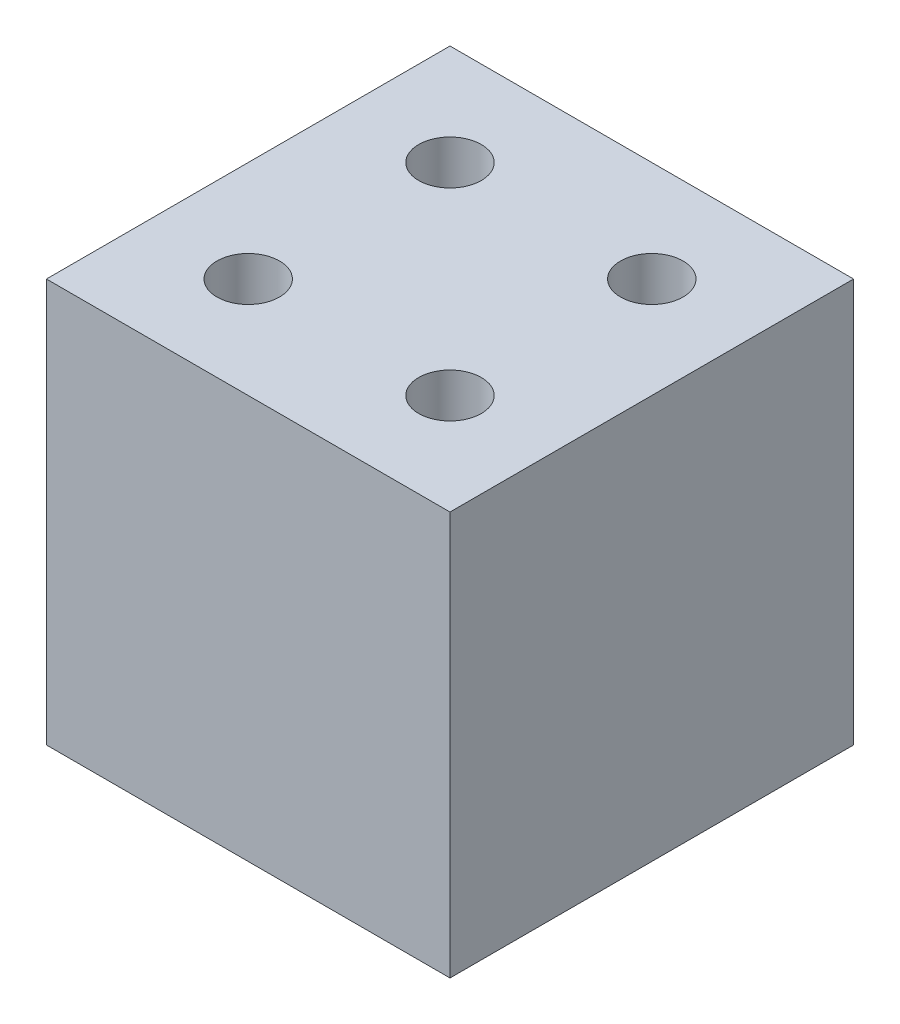
ISO-10303-21;
HEADER;
FILE_DESCRIPTION(('STEP AP214'),'2;1');
FILE_NAME('part.step','',(''),(''),'','','');
FILE_SCHEMA(('AUTOMOTIVE_DESIGN { 1 0 10303 214 1 1 1 1 }'));
ENDSEC;
DATA;
#1=APPLICATION_CONTEXT('core data for automotive mechanical design processes');
#2=APPLICATION_PROTOCOL_DEFINITION('international standard','automotive_design',2000,#1);
#3=PRODUCT_CONTEXT('',#1,'mechanical');
#4=PRODUCT('Part','Part','',(#3));
#5=PRODUCT_RELATED_PRODUCT_CATEGORY('part','',(#4));
#6=PRODUCT_DEFINITION_FORMATION('','',#4);
#7=PRODUCT_DEFINITION_CONTEXT('part definition',#1,'design');
#8=PRODUCT_DEFINITION('design','',#6,#7);
#9=PRODUCT_DEFINITION_SHAPE('','',#8);
#10=(LENGTH_UNIT() NAMED_UNIT(*) SI_UNIT(.MILLI.,.METRE.));
#11=(NAMED_UNIT(*) PLANE_ANGLE_UNIT() SI_UNIT($,.RADIAN.));
#12=(NAMED_UNIT(*) SI_UNIT($,.STERADIAN.) SOLID_ANGLE_UNIT());
#13=UNCERTAINTY_MEASURE_WITH_UNIT(LENGTH_MEASURE(1.E-05),#10,'distance_accuracy_value','');
#14=(GEOMETRIC_REPRESENTATION_CONTEXT(3) GLOBAL_UNCERTAINTY_ASSIGNED_CONTEXT((#13)) GLOBAL_UNIT_ASSIGNED_CONTEXT((#10,
#11,#12)) REPRESENTATION_CONTEXT('',''));
#15=CARTESIAN_POINT('',(0.,0.,0.));
#16=DIRECTION('',(0.,0.,1.));
#17=DIRECTION('',(1.,0.,0.));
#18=AXIS2_PLACEMENT_3D('',#15,#16,#17);
#19=CARTESIAN_POINT('',(0.,20.,0.));
#20=DIRECTION('',(0.,-1.,0.));
#21=DIRECTION('',(0.,0.,-1.));
#22=AXIS2_PLACEMENT_3D('',#19,#20,#21);
#23=PLANE('',#22);
#24=DIRECTION('',(0.,0.,-1.));
#25=VECTOR('',#24,1.);
#26=CARTESIAN_POINT('',(9.99999999999999,20.,10.));
#27=LINE('',#26,#25);
#28=CARTESIAN_POINT('',(9.99999999999999,20.,10.));
#29=VERTEX_POINT('',#28);
#30=CARTESIAN_POINT('',(9.99999999999999,20.,-10.));
#31=VERTEX_POINT('',#30);
#32=EDGE_CURVE('E92',#29,#31,#27,.T.);
#33=ORIENTED_EDGE('',*,*,#32,.T.);
#34=DIRECTION('',(-1.,0.,0.));
#35=VECTOR('',#34,1.);
#36=CARTESIAN_POINT('',(-10.,20.,-10.));
#37=LINE('',#36,#35);
#38=CARTESIAN_POINT('',(-10.,20.,-10.));
#39=VERTEX_POINT('',#38);
#40=EDGE_CURVE('E87',#31,#39,#37,.T.);
#41=ORIENTED_EDGE('',*,*,#40,.T.);
#42=DIRECTION('',(0.,0.,1.));
#43=VECTOR('',#42,1.);
#44=CARTESIAN_POINT('',(-10.,20.,10.));
#45=LINE('',#44,#43);
#46=CARTESIAN_POINT('',(-10.,20.,10.));
#47=VERTEX_POINT('',#46);
#48=EDGE_CURVE('E90',#39,#47,#45,.T.);
#49=ORIENTED_EDGE('',*,*,#48,.T.);
#50=DIRECTION('',(1.,0.,0.));
#51=VECTOR('',#50,1.);
#52=CARTESIAN_POINT('',(-10.,20.,10.));
#53=LINE('',#52,#51);
#54=EDGE_CURVE('E57',#47,#29,#53,.T.);
#55=ORIENTED_EDGE('',*,*,#54,.T.);
#56=EDGE_LOOP('',(#33,#41,#49,#55));
#57=FACE_BOUND('',#56,.T.);
#58=CARTESIAN_POINT('',(-5.,20.,-5.));
#59=DIRECTION('',(0.,1.,0.));
#60=DIRECTION('',(0.,0.,1.));
#61=AXIS2_PLACEMENT_3D('',#58,#59,#60);
#62=CIRCLE('',#61,1.55);
#63=CARTESIAN_POINT('',(-5.,20.,-3.45));
#64=VERTEX_POINT('',#63);
#65=EDGE_CURVE('E112',#64,#64,#62,.T.);
#66=ORIENTED_EDGE('',*,*,#65,.F.);
#67=EDGE_LOOP('',(#66));
#68=FACE_BOUND('',#67,.T.);
#69=CARTESIAN_POINT('',(5.,20.,-5.));
#70=DIRECTION('',(0.,1.,0.));
#71=DIRECTION('',(0.,0.,1.));
#72=AXIS2_PLACEMENT_3D('',#69,#70,#71);
#73=CIRCLE('',#72,1.55);
#74=CARTESIAN_POINT('',(5.,20.,-3.45));
#75=VERTEX_POINT('',#74);
#76=EDGE_CURVE('E134',#75,#75,#73,.T.);
#77=ORIENTED_EDGE('',*,*,#76,.F.);
#78=EDGE_LOOP('',(#77));
#79=FACE_BOUND('',#78,.T.);
#80=CARTESIAN_POINT('',(-5.,20.,5.));
#81=DIRECTION('',(0.,1.,0.));
#82=DIRECTION('',(0.,0.,1.));
#83=AXIS2_PLACEMENT_3D('',#80,#81,#82);
#84=CIRCLE('',#83,1.55);
#85=CARTESIAN_POINT('',(-5.,20.,6.55));
#86=VERTEX_POINT('',#85);
#87=EDGE_CURVE('E142',#86,#86,#84,.T.);
#88=ORIENTED_EDGE('',*,*,#87,.F.);
#89=EDGE_LOOP('',(#88));
#90=FACE_BOUND('',#89,.T.);
#91=CARTESIAN_POINT('',(5.,20.,5.));
#92=DIRECTION('',(0.,1.,0.));
#93=DIRECTION('',(0.,0.,1.));
#94=AXIS2_PLACEMENT_3D('',#91,#92,#93);
#95=CIRCLE('',#94,1.55);
#96=CARTESIAN_POINT('',(5.,20.,6.55));
#97=VERTEX_POINT('',#96);
#98=EDGE_CURVE('E150',#97,#97,#95,.T.);
#99=ORIENTED_EDGE('',*,*,#98,.F.);
#100=EDGE_LOOP('',(#99));
#101=FACE_BOUND('',#100,.T.);
#102=ADVANCED_FACE('F39',(#57,#68,#79,#90,#101),#23,.F.);
#103=CARTESIAN_POINT('',(0.,0.,0.));
#104=DIRECTION('',(0.,-1.,0.));
#105=DIRECTION('',(0.,0.,-1.));
#106=AXIS2_PLACEMENT_3D('',#103,#104,#105);
#107=PLANE('',#106);
#108=CARTESIAN_POINT('',(-5.,0.,5.));
#109=DIRECTION('',(0.,1.,0.));
#110=DIRECTION('',(0.,0.,1.));
#111=AXIS2_PLACEMENT_3D('',#108,#109,#110);
#112=CIRCLE('',#111,1.55);
#113=CARTESIAN_POINT('',(-5.,0.,6.55));
#114=VERTEX_POINT('',#113);
#115=EDGE_CURVE('E146',#114,#114,#112,.T.);
#116=ORIENTED_EDGE('',*,*,#115,.T.);
#117=EDGE_LOOP('',(#116));
#118=FACE_BOUND('',#117,.T.);
#119=CARTESIAN_POINT('',(-5.,0.,-5.));
#120=DIRECTION('',(0.,1.,0.));
#121=DIRECTION('',(0.,0.,1.));
#122=AXIS2_PLACEMENT_3D('',#119,#120,#121);
#123=CIRCLE('',#122,1.55);
#124=CARTESIAN_POINT('',(-5.,0.,-3.45));
#125=VERTEX_POINT('',#124);
#126=EDGE_CURVE('E130',#125,#125,#123,.T.);
#127=ORIENTED_EDGE('',*,*,#126,.T.);
#128=EDGE_LOOP('',(#127));
#129=FACE_BOUND('',#128,.T.);
#130=DIRECTION('',(0.,0.,-1.));
#131=VECTOR('',#130,1.);
#132=CARTESIAN_POINT('',(9.99999999999999,0.,10.));
#133=LINE('',#132,#131);
#134=CARTESIAN_POINT('',(9.99999999999999,0.,10.));
#135=VERTEX_POINT('',#134);
#136=CARTESIAN_POINT('',(9.99999999999999,0.,-10.));
#137=VERTEX_POINT('',#136);
#138=EDGE_CURVE('E108',#135,#137,#133,.T.);
#139=ORIENTED_EDGE('',*,*,#138,.F.);
#140=DIRECTION('',(1.,0.,0.));
#141=VECTOR('',#140,1.);
#142=CARTESIAN_POINT('',(-10.,0.,10.));
#143=LINE('',#142,#141);
#144=CARTESIAN_POINT('',(-10.,0.,10.));
#145=VERTEX_POINT('',#144);
#146=EDGE_CURVE('E80',#145,#135,#143,.T.);
#147=ORIENTED_EDGE('',*,*,#146,.F.);
#148=DIRECTION('',(0.,0.,1.));
#149=VECTOR('',#148,1.);
#150=CARTESIAN_POINT('',(-10.,0.,10.));
#151=LINE('',#150,#149);
#152=CARTESIAN_POINT('',(-10.,0.,-10.));
#153=VERTEX_POINT('',#152);
#154=EDGE_CURVE('E74',#153,#145,#151,.T.);
#155=ORIENTED_EDGE('',*,*,#154,.F.);
#156=DIRECTION('',(-1.,0.,0.));
#157=VECTOR('',#156,1.);
#158=CARTESIAN_POINT('',(-10.,0.,-10.));
#159=LINE('',#158,#157);
#160=EDGE_CURVE('E97',#137,#153,#159,.T.);
#161=ORIENTED_EDGE('',*,*,#160,.F.);
#162=EDGE_LOOP('',(#139,#147,#155,#161));
#163=FACE_BOUND('',#162,.T.);
#164=CARTESIAN_POINT('',(5.,0.,-5.));
#165=DIRECTION('',(0.,1.,0.));
#166=DIRECTION('',(0.,0.,1.));
#167=AXIS2_PLACEMENT_3D('',#164,#165,#166);
#168=CIRCLE('',#167,1.55);
#169=CARTESIAN_POINT('',(5.,0.,-3.45));
#170=VERTEX_POINT('',#169);
#171=EDGE_CURVE('E138',#170,#170,#168,.T.);
#172=ORIENTED_EDGE('',*,*,#171,.T.);
#173=EDGE_LOOP('',(#172));
#174=FACE_BOUND('',#173,.T.);
#175=CARTESIAN_POINT('',(5.,0.,5.));
#176=DIRECTION('',(0.,1.,0.));
#177=DIRECTION('',(0.,0.,1.));
#178=AXIS2_PLACEMENT_3D('',#175,#176,#177);
#179=CIRCLE('',#178,1.55);
#180=CARTESIAN_POINT('',(5.,0.,6.55));
#181=VERTEX_POINT('',#180);
#182=EDGE_CURVE('E154',#181,#181,#179,.T.);
#183=ORIENTED_EDGE('',*,*,#182,.T.);
#184=EDGE_LOOP('',(#183));
#185=FACE_BOUND('',#184,.T.);
#186=ADVANCED_FACE('F125',(#118,#129,#163,#174,#185),#107,.T.);
#187=CARTESIAN_POINT('',(9.99999999999999,20.,10.));
#188=DIRECTION('',(-1.,0.,0.));
#189=DIRECTION('',(0.,0.,1.));
#190=AXIS2_PLACEMENT_3D('',#187,#188,#189);
#191=PLANE('',#190);
#192=ORIENTED_EDGE('',*,*,#138,.T.);
#193=DIRECTION('',(0.,-1.,0.));
#194=VECTOR('',#193,1.);
#195=CARTESIAN_POINT('',(9.99999999999999,20.,-10.));
#196=LINE('',#195,#194);
#197=EDGE_CURVE('E11',#31,#137,#196,.T.);
#198=ORIENTED_EDGE('',*,*,#197,.F.);
#199=ORIENTED_EDGE('',*,*,#32,.F.);
#200=DIRECTION('',(0.,-1.,0.));
#201=VECTOR('',#200,1.);
#202=CARTESIAN_POINT('',(9.99999999999999,20.,10.));
#203=LINE('',#202,#201);
#204=EDGE_CURVE('E104',#29,#135,#203,.T.);
#205=ORIENTED_EDGE('',*,*,#204,.T.);
#206=EDGE_LOOP('',(#192,#198,#199,#205));
#207=FACE_BOUND('',#206,.T.);
#208=ADVANCED_FACE('F41',(#207),#191,.F.);
#209=CARTESIAN_POINT('',(-10.,20.,-10.));
#210=DIRECTION('',(0.,0.,1.));
#211=DIRECTION('',(1.,0.,0.));
#212=AXIS2_PLACEMENT_3D('',#209,#210,#211);
#213=PLANE('',#212);
#214=ORIENTED_EDGE('',*,*,#160,.T.);
#215=DIRECTION('',(0.,-1.,0.));
#216=VECTOR('',#215,1.);
#217=CARTESIAN_POINT('',(-10.,20.,-10.));
#218=LINE('',#217,#216);
#219=EDGE_CURVE('E49',#39,#153,#218,.T.);
#220=ORIENTED_EDGE('',*,*,#219,.F.);
#221=ORIENTED_EDGE('',*,*,#40,.F.);
#222=ORIENTED_EDGE('',*,*,#197,.T.);
#223=EDGE_LOOP('',(#214,#220,#221,#222));
#224=FACE_BOUND('',#223,.T.);
#225=ADVANCED_FACE('F96',(#224),#213,.F.);
#226=CARTESIAN_POINT('',(-10.,20.,10.));
#227=DIRECTION('',(1.,0.,0.));
#228=DIRECTION('',(0.,0.,-1.));
#229=AXIS2_PLACEMENT_3D('',#226,#227,#228);
#230=PLANE('',#229);
#231=ORIENTED_EDGE('',*,*,#154,.T.);
#232=DIRECTION('',(0.,-1.,0.));
#233=VECTOR('',#232,1.);
#234=CARTESIAN_POINT('',(-10.,20.,10.));
#235=LINE('',#234,#233);
#236=EDGE_CURVE('E99',#47,#145,#235,.T.);
#237=ORIENTED_EDGE('',*,*,#236,.F.);
#238=ORIENTED_EDGE('',*,*,#48,.F.);
#239=ORIENTED_EDGE('',*,*,#219,.T.);
#240=EDGE_LOOP('',(#231,#237,#238,#239));
#241=FACE_BOUND('',#240,.T.);
#242=ADVANCED_FACE('F100',(#241),#230,.F.);
#243=CARTESIAN_POINT('',(-10.,20.,10.));
#244=DIRECTION('',(0.,0.,-1.));
#245=DIRECTION('',(-1.,0.,0.));
#246=AXIS2_PLACEMENT_3D('',#243,#244,#245);
#247=PLANE('',#246);
#248=ORIENTED_EDGE('',*,*,#146,.T.);
#249=ORIENTED_EDGE('',*,*,#204,.F.);
#250=ORIENTED_EDGE('',*,*,#54,.F.);
#251=ORIENTED_EDGE('',*,*,#236,.T.);
#252=EDGE_LOOP('',(#248,#249,#250,#251));
#253=FACE_BOUND('',#252,.T.);
#254=ADVANCED_FACE('F122',(#253),#247,.F.);
#255=CARTESIAN_POINT('',(-5.,20.,-5.));
#256=DIRECTION('',(0.,-1.,0.));
#257=DIRECTION('',(0.,0.,-1.));
#258=AXIS2_PLACEMENT_3D('',#255,#256,#257);
#259=CYLINDRICAL_SURFACE('',#258,1.55);
#260=ORIENTED_EDGE('',*,*,#65,.T.);
#261=EDGE_LOOP('',(#260));
#262=FACE_BOUND('',#261,.T.);
#263=ORIENTED_EDGE('',*,*,#126,.F.);
#264=EDGE_LOOP('',(#263));
#265=FACE_BOUND('',#264,.T.);
#266=ADVANCED_FACE('F173',(#262,#265),#259,.F.);
#267=CARTESIAN_POINT('',(5.,20.,-5.));
#268=DIRECTION('',(0.,-1.,0.));
#269=DIRECTION('',(0.,0.,-1.));
#270=AXIS2_PLACEMENT_3D('',#267,#268,#269);
#271=CYLINDRICAL_SURFACE('',#270,1.55);
#272=ORIENTED_EDGE('',*,*,#76,.T.);
#273=EDGE_LOOP('',(#272));
#274=FACE_BOUND('',#273,.T.);
#275=ORIENTED_EDGE('',*,*,#171,.F.);
#276=EDGE_LOOP('',(#275));
#277=FACE_BOUND('',#276,.T.);
#278=ADVANCED_FACE('F219',(#274,#277),#271,.F.);
#279=CARTESIAN_POINT('',(-5.,20.,5.));
#280=DIRECTION('',(0.,-1.,0.));
#281=DIRECTION('',(0.,0.,-1.));
#282=AXIS2_PLACEMENT_3D('',#279,#280,#281);
#283=CYLINDRICAL_SURFACE('',#282,1.55);
#284=ORIENTED_EDGE('',*,*,#87,.T.);
#285=EDGE_LOOP('',(#284));
#286=FACE_BOUND('',#285,.T.);
#287=ORIENTED_EDGE('',*,*,#115,.F.);
#288=EDGE_LOOP('',(#287));
#289=FACE_BOUND('',#288,.T.);
#290=ADVANCED_FACE('F227',(#286,#289),#283,.F.);
#291=CARTESIAN_POINT('',(5.,20.,5.));
#292=DIRECTION('',(0.,-1.,0.));
#293=DIRECTION('',(0.,0.,-1.));
#294=AXIS2_PLACEMENT_3D('',#291,#292,#293);
#295=CYLINDRICAL_SURFACE('',#294,1.55);
#296=ORIENTED_EDGE('',*,*,#98,.T.);
#297=EDGE_LOOP('',(#296));
#298=FACE_BOUND('',#297,.T.);
#299=ORIENTED_EDGE('',*,*,#182,.F.);
#300=EDGE_LOOP('',(#299));
#301=FACE_BOUND('',#300,.T.);
#302=ADVANCED_FACE('F162',(#298,#301),#295,.F.);
#303=CLOSED_SHELL('',(#102,#186,#208,#225,#242,#254,#266,#278,#290,#302));
#304=MANIFOLD_SOLID_BREP('B2',#303);
#305=ADVANCED_BREP_SHAPE_REPRESENTATION('',(#18,#304),#14);
#306=SHAPE_DEFINITION_REPRESENTATION(#9,#305);
ENDSEC;
END-ISO-10303-21;
